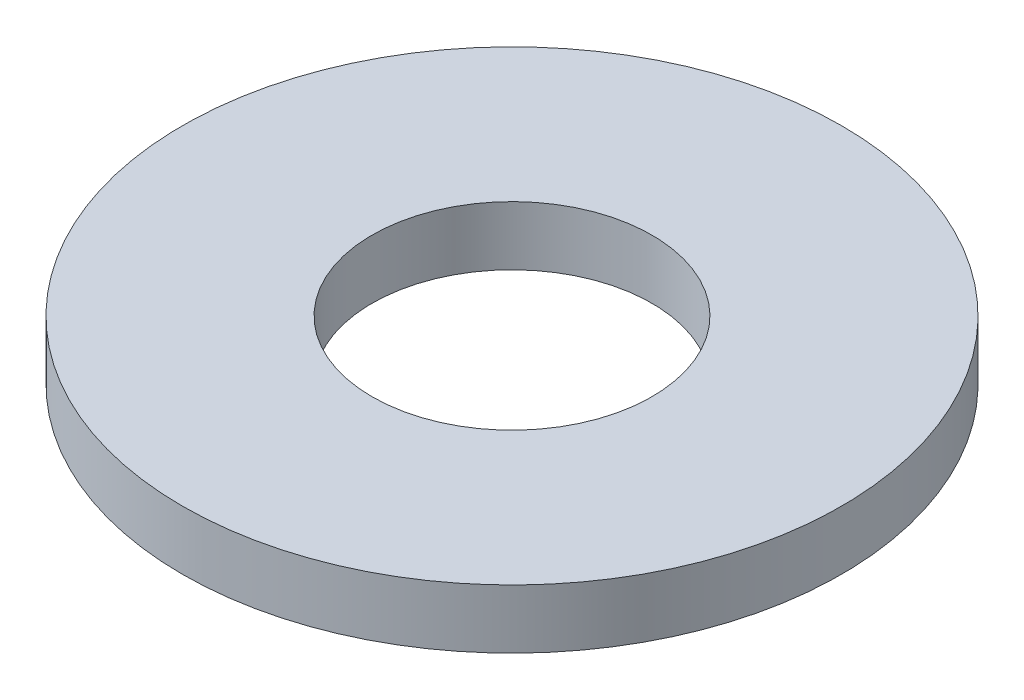
ISO-10303-21;
HEADER;
FILE_DESCRIPTION(('STEP AP214'),'2;1');
FILE_NAME('part.step','',(''),(''),'','','');
FILE_SCHEMA(('AUTOMOTIVE_DESIGN { 1 0 10303 214 1 1 1 1 }'));
ENDSEC;
DATA;
#1=APPLICATION_CONTEXT('core data for automotive mechanical design processes');
#2=APPLICATION_PROTOCOL_DEFINITION('international standard','automotive_design',2000,#1);
#3=PRODUCT_CONTEXT('',#1,'mechanical');
#4=PRODUCT('Part','Part','',(#3));
#5=PRODUCT_RELATED_PRODUCT_CATEGORY('part','',(#4));
#6=PRODUCT_DEFINITION_FORMATION('','',#4);
#7=PRODUCT_DEFINITION_CONTEXT('part definition',#1,'design');
#8=PRODUCT_DEFINITION('design','',#6,#7);
#9=PRODUCT_DEFINITION_SHAPE('','',#8);
#10=(LENGTH_UNIT() NAMED_UNIT(*) SI_UNIT(.MILLI.,.METRE.));
#11=(NAMED_UNIT(*) PLANE_ANGLE_UNIT() SI_UNIT($,.RADIAN.));
#12=(NAMED_UNIT(*) SI_UNIT($,.STERADIAN.) SOLID_ANGLE_UNIT());
#13=UNCERTAINTY_MEASURE_WITH_UNIT(LENGTH_MEASURE(1.E-05),#10,'distance_accuracy_value','');
#14=(GEOMETRIC_REPRESENTATION_CONTEXT(3) GLOBAL_UNCERTAINTY_ASSIGNED_CONTEXT((#13)) GLOBAL_UNIT_ASSIGNED_CONTEXT((#10,
#11,#12)) REPRESENTATION_CONTEXT('',''));
#15=CARTESIAN_POINT('',(0.,0.,0.));
#16=DIRECTION('',(0.,0.,1.));
#17=DIRECTION('',(1.,0.,0.));
#18=AXIS2_PLACEMENT_3D('',#15,#16,#17);
#19=CARTESIAN_POINT('',(0.,2.8448,0.));
#20=DIRECTION('',(0.,1.,0.));
#21=DIRECTION('',(0.,0.,1.));
#22=AXIS2_PLACEMENT_3D('',#19,#20,#21);
#23=PLANE('',#22);
#24=CARTESIAN_POINT('',(0.,2.8448,0.));
#25=DIRECTION('',(0.,1.,0.));
#26=DIRECTION('',(0.,0.,1.));
#27=AXIS2_PLACEMENT_3D('',#24,#25,#26);
#28=CIRCLE('',#27,15.875);
#29=CARTESIAN_POINT('',(0.,2.8448,15.875));
#30=VERTEX_POINT('',#29);
#31=EDGE_CURVE('E10',#30,#30,#28,.T.);
#32=ORIENTED_EDGE('',*,*,#31,.T.);
#33=EDGE_LOOP('',(#32));
#34=FACE_BOUND('',#33,.T.);
#35=CARTESIAN_POINT('',(0.,2.8448,0.));
#36=DIRECTION('',(0.,1.,0.));
#37=DIRECTION('',(0.,0.,1.));
#38=AXIS2_PLACEMENT_3D('',#35,#36,#37);
#39=CIRCLE('',#38,6.7437);
#40=CARTESIAN_POINT('',(0.,2.8448,6.7437));
#41=VERTEX_POINT('',#40);
#42=EDGE_CURVE('E43',#41,#41,#39,.T.);
#43=ORIENTED_EDGE('',*,*,#42,.F.);
#44=EDGE_LOOP('',(#43));
#45=FACE_BOUND('',#44,.T.);
#46=ADVANCED_FACE('F32',(#34,#45),#23,.T.);
#47=CARTESIAN_POINT('',(0.,0.,0.));
#48=DIRECTION('',(0.,1.,0.));
#49=DIRECTION('',(0.,0.,1.));
#50=AXIS2_PLACEMENT_3D('',#47,#48,#49);
#51=PLANE('',#50);
#52=CARTESIAN_POINT('',(0.,0.,0.));
#53=DIRECTION('',(0.,1.,0.));
#54=DIRECTION('',(0.,0.,1.));
#55=AXIS2_PLACEMENT_3D('',#52,#53,#54);
#56=CIRCLE('',#55,15.875);
#57=CARTESIAN_POINT('',(0.,0.,15.875));
#58=VERTEX_POINT('',#57);
#59=EDGE_CURVE('E36',#58,#58,#56,.T.);
#60=ORIENTED_EDGE('',*,*,#59,.F.);
#61=EDGE_LOOP('',(#60));
#62=FACE_BOUND('',#61,.T.);
#63=CARTESIAN_POINT('',(0.,0.,0.));
#64=DIRECTION('',(0.,1.,0.));
#65=DIRECTION('',(0.,0.,1.));
#66=AXIS2_PLACEMENT_3D('',#63,#64,#65);
#67=CIRCLE('',#66,6.7437);
#68=CARTESIAN_POINT('',(0.,0.,6.7437));
#69=VERTEX_POINT('',#68);
#70=EDGE_CURVE('E45',#69,#69,#67,.T.);
#71=ORIENTED_EDGE('',*,*,#70,.T.);
#72=EDGE_LOOP('',(#71));
#73=FACE_BOUND('',#72,.T.);
#74=ADVANCED_FACE('F55',(#62,#73),#51,.F.);
#75=CARTESIAN_POINT('',(0.,2.8448,0.));
#76=DIRECTION('',(0.,-1.,0.));
#77=DIRECTION('',(0.,0.,-1.));
#78=AXIS2_PLACEMENT_3D('',#75,#76,#77);
#79=CYLINDRICAL_SURFACE('',#78,15.875);
#80=ORIENTED_EDGE('',*,*,#31,.F.);
#81=EDGE_LOOP('',(#80));
#82=FACE_BOUND('',#81,.T.);
#83=ORIENTED_EDGE('',*,*,#59,.T.);
#84=EDGE_LOOP('',(#83));
#85=FACE_BOUND('',#84,.T.);
#86=ADVANCED_FACE('F34',(#82,#85),#79,.T.);
#87=CARTESIAN_POINT('',(0.,2.8448,0.));
#88=DIRECTION('',(0.,-1.,0.));
#89=DIRECTION('',(0.,0.,-1.));
#90=AXIS2_PLACEMENT_3D('',#87,#88,#89);
#91=CYLINDRICAL_SURFACE('',#90,6.7437);
#92=ORIENTED_EDGE('',*,*,#42,.T.);
#93=EDGE_LOOP('',(#92));
#94=FACE_BOUND('',#93,.T.);
#95=ORIENTED_EDGE('',*,*,#70,.F.);
#96=EDGE_LOOP('',(#95));
#97=FACE_BOUND('',#96,.T.);
#98=ADVANCED_FACE('F51',(#94,#97),#91,.F.);
#99=CLOSED_SHELL('',(#46,#74,#86,#98));
#100=MANIFOLD_SOLID_BREP('B2',#99);
#101=ADVANCED_BREP_SHAPE_REPRESENTATION('',(#18,#100),#14);
#102=SHAPE_DEFINITION_REPRESENTATION(#9,#101);
ENDSEC;
END-ISO-10303-21;
